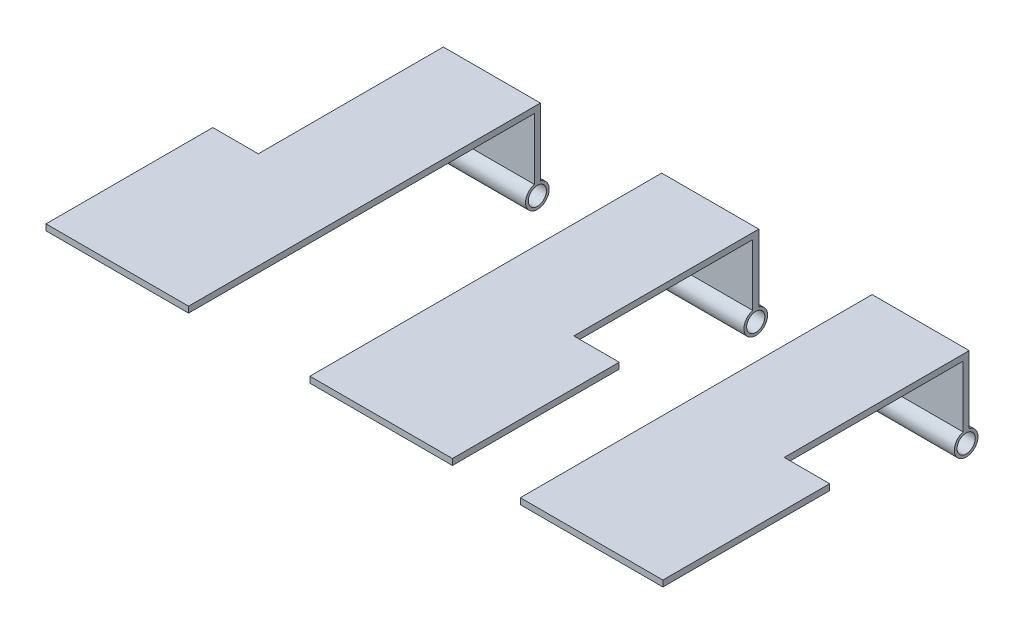
ISO-10303-21;
HEADER;
FILE_DESCRIPTION(('STEP AP214'),'2;1');
FILE_NAME('part.step','',(''),(''),'','','');
FILE_SCHEMA(('AUTOMOTIVE_DESIGN { 1 0 10303 214 1 1 1 1 }'));
ENDSEC;
DATA;
#1=APPLICATION_CONTEXT('core data for automotive mechanical design processes');
#2=APPLICATION_PROTOCOL_DEFINITION('international standard','automotive_design',2000,#1);
#3=PRODUCT_CONTEXT('',#1,'mechanical');
#4=PRODUCT('Part','Part','',(#3));
#5=PRODUCT_RELATED_PRODUCT_CATEGORY('part','',(#4));
#6=PRODUCT_DEFINITION_FORMATION('','',#4);
#7=PRODUCT_DEFINITION_CONTEXT('part definition',#1,'design');
#8=PRODUCT_DEFINITION('design','',#6,#7);
#9=PRODUCT_DEFINITION_SHAPE('','',#8);
#10=(LENGTH_UNIT() NAMED_UNIT(*) SI_UNIT(.MILLI.,.METRE.));
#11=(NAMED_UNIT(*) PLANE_ANGLE_UNIT() SI_UNIT($,.RADIAN.));
#12=(NAMED_UNIT(*) SI_UNIT($,.STERADIAN.) SOLID_ANGLE_UNIT());
#13=UNCERTAINTY_MEASURE_WITH_UNIT(LENGTH_MEASURE(1.E-05),#10,'distance_accuracy_value','');
#14=(GEOMETRIC_REPRESENTATION_CONTEXT(3) GLOBAL_UNCERTAINTY_ASSIGNED_CONTEXT((#13)) GLOBAL_UNIT_ASSIGNED_CONTEXT((#10,
#11,#12)) REPRESENTATION_CONTEXT('',''));
#15=CARTESIAN_POINT('',(0.,0.,0.));
#16=DIRECTION('',(0.,0.,1.));
#17=DIRECTION('',(1.,0.,0.));
#18=AXIS2_PLACEMENT_3D('',#15,#16,#17);
#19=CARTESIAN_POINT('',(16.,0.,0.500534490034143));
#20=DIRECTION('',(0.,0.,-1.));
#21=DIRECTION('',(-1.,0.,0.));
#22=AXIS2_PLACEMENT_3D('',#19,#20,#21);
#23=PLANE('',#22);
#24=DIRECTION('',(0.,-1.,0.));
#25=VECTOR('',#24,1.);
#26=CARTESIAN_POINT('',(16.,0.,0.500534490034143));
#27=LINE('',#26,#25);
#28=CARTESIAN_POINT('',(16.,12.,0.500534490034143));
#29=VERTEX_POINT('',#28);
#30=CARTESIAN_POINT('',(16.,1.88466581236204,0.500534490034143));
#31=VERTEX_POINT('',#30);
#32=EDGE_CURVE('E61',#29,#31,#27,.T.);
#33=ORIENTED_EDGE('',*,*,#32,.F.);
#34=DIRECTION('',(-1.,0.,0.));
#35=VECTOR('',#34,1.);
#36=CARTESIAN_POINT('',(16.,12.,0.500534490034143));
#37=LINE('',#36,#35);
#38=CARTESIAN_POINT('',(0.,12.,0.500534490034143));
#39=VERTEX_POINT('',#38);
#40=EDGE_CURVE('E65',#29,#39,#37,.T.);
#41=ORIENTED_EDGE('',*,*,#40,.T.);
#42=DIRECTION('',(0.,-1.,0.));
#43=VECTOR('',#42,1.);
#44=CARTESIAN_POINT('',(0.,0.,0.500534490034143));
#45=LINE('',#44,#43);
#46=CARTESIAN_POINT('',(0.,1.88466581236204,0.500534490034143));
#47=VERTEX_POINT('',#46);
#48=EDGE_CURVE('E116',#39,#47,#45,.T.);
#49=ORIENTED_EDGE('',*,*,#48,.T.);
#50=DIRECTION('',(-1.,0.,0.));
#51=VECTOR('',#50,1.);
#52=CARTESIAN_POINT('',(16.,1.88466581236204,0.500534490034143));
#53=LINE('',#52,#51);
#54=EDGE_CURVE('E12',#31,#47,#53,.T.);
#55=ORIENTED_EDGE('',*,*,#54,.F.);
#56=EDGE_LOOP('',(#33,#41,#49,#55));
#57=FACE_BOUND('',#56,.T.);
#58=ADVANCED_FACE('F46',(#57),#23,.F.);
#59=CARTESIAN_POINT('',(16.,0.,0.));
#60=DIRECTION('',(-1.,0.,0.));
#61=DIRECTION('',(0.,0.,1.));
#62=AXIS2_PLACEMENT_3D('',#59,#60,#61);
#63=CYLINDRICAL_SURFACE('',#62,1.95);
#64=CARTESIAN_POINT('',(0.,0.,0.));
#65=DIRECTION('',(1.,0.,0.));
#66=DIRECTION('',(0.,0.,-1.));
#67=AXIS2_PLACEMENT_3D('',#64,#65,#66);
#68=CIRCLE('',#67,1.95);
#69=CARTESIAN_POINT('',(0.,1.88494939039608,-0.499465509965857));
#70=VERTEX_POINT('',#69);
#71=EDGE_CURVE('E173',#47,#70,#68,.T.);
#72=ORIENTED_EDGE('',*,*,#71,.T.);
#73=DIRECTION('',(-1.,0.,0.));
#74=VECTOR('',#73,1.);
#75=CARTESIAN_POINT('',(16.,1.88494939039608,-0.499465509965857));
#76=LINE('',#75,#74);
#77=CARTESIAN_POINT('',(16.,1.88494939039608,-0.499465509965857));
#78=VERTEX_POINT('',#77);
#79=EDGE_CURVE('E54',#78,#70,#76,.T.);
#80=ORIENTED_EDGE('',*,*,#79,.F.);
#81=CARTESIAN_POINT('',(16.,0.,0.));
#82=DIRECTION('',(1.,0.,0.));
#83=DIRECTION('',(0.,0.,-1.));
#84=AXIS2_PLACEMENT_3D('',#81,#82,#83);
#85=CIRCLE('',#84,1.95);
#86=EDGE_CURVE('E162',#31,#78,#85,.T.);
#87=ORIENTED_EDGE('',*,*,#86,.F.);
#88=ORIENTED_EDGE('',*,*,#54,.T.);
#89=EDGE_LOOP('',(#72,#80,#87,#88));
#90=FACE_BOUND('',#89,.T.);
#91=ADVANCED_FACE('F189',(#90),#63,.T.);
#92=CARTESIAN_POINT('',(16.,0.,-0.499465509965857));
#93=DIRECTION('',(0.,0.,-1.));
#94=DIRECTION('',(-1.,0.,0.));
#95=AXIS2_PLACEMENT_3D('',#92,#93,#94);
#96=PLANE('',#95);
#97=DIRECTION('',(0.,-1.,0.));
#98=VECTOR('',#97,1.);
#99=CARTESIAN_POINT('',(0.,0.,-0.499465509965857));
#100=LINE('',#99,#98);
#101=CARTESIAN_POINT('',(0.,13.,-0.499465509965857));
#102=VERTEX_POINT('',#101);
#103=EDGE_CURVE('E176',#102,#70,#100,.T.);
#104=ORIENTED_EDGE('',*,*,#103,.F.);
#105=DIRECTION('',(-1.,0.,0.));
#106=VECTOR('',#105,1.);
#107=CARTESIAN_POINT('',(16.,13.,-0.499465509965857));
#108=LINE('',#107,#106);
#109=CARTESIAN_POINT('',(16.,13.,-0.499465509965857));
#110=VERTEX_POINT('',#109);
#111=EDGE_CURVE('E169',#110,#102,#108,.T.);
#112=ORIENTED_EDGE('',*,*,#111,.F.);
#113=DIRECTION('',(0.,-1.,0.));
#114=VECTOR('',#113,1.);
#115=CARTESIAN_POINT('',(16.,0.,-0.499465509965857));
#116=LINE('',#115,#114);
#117=EDGE_CURVE('E164',#110,#78,#116,.T.);
#118=ORIENTED_EDGE('',*,*,#117,.T.);
#119=ORIENTED_EDGE('',*,*,#79,.T.);
#120=EDGE_LOOP('',(#104,#112,#118,#119));
#121=FACE_BOUND('',#120,.T.);
#122=ADVANCED_FACE('F184',(#121),#96,.T.);
#123=CARTESIAN_POINT('',(16.,0.,0.));
#124=DIRECTION('',(-1.,0.,0.));
#125=DIRECTION('',(0.,0.,1.));
#126=AXIS2_PLACEMENT_3D('',#123,#124,#125);
#127=CYLINDRICAL_SURFACE('',#126,1.5);
#128=CARTESIAN_POINT('',(16.,0.,0.));
#129=DIRECTION('',(1.,0.,0.));
#130=DIRECTION('',(0.,0.,-1.));
#131=AXIS2_PLACEMENT_3D('',#128,#129,#130);
#132=CIRCLE('',#131,1.5);
#133=CARTESIAN_POINT('',(16.,0.,-1.5));
#134=VERTEX_POINT('',#133);
#135=EDGE_CURVE('E157',#134,#134,#132,.T.);
#136=ORIENTED_EDGE('',*,*,#135,.T.);
#137=EDGE_LOOP('',(#136));
#138=FACE_BOUND('',#137,.T.);
#139=CARTESIAN_POINT('',(0.,0.,0.));
#140=DIRECTION('',(1.,0.,0.));
#141=DIRECTION('',(0.,0.,-1.));
#142=AXIS2_PLACEMENT_3D('',#139,#140,#141);
#143=CIRCLE('',#142,1.5);
#144=CARTESIAN_POINT('',(0.,0.,-1.5));
#145=VERTEX_POINT('',#144);
#146=EDGE_CURVE('E156',#145,#145,#143,.T.);
#147=ORIENTED_EDGE('',*,*,#146,.F.);
#148=EDGE_LOOP('',(#147));
#149=FACE_BOUND('',#148,.T.);
#150=ADVANCED_FACE('F48',(#138,#149),#127,.F.);
#151=CARTESIAN_POINT('',(16.,13.,0.));
#152=DIRECTION('',(0.,1.,0.));
#153=DIRECTION('',(0.,0.,1.));
#154=AXIS2_PLACEMENT_3D('',#151,#152,#153);
#155=PLANE('',#154);
#156=ORIENTED_EDGE('',*,*,#111,.T.);
#157=DIRECTION('',(0.,0.,-1.));
#158=VECTOR('',#157,1.);
#159=CARTESIAN_POINT('',(0.,13.,0.));
#160=LINE('',#159,#158);
#161=CARTESIAN_POINT('',(0.,13.,57.5));
#162=VERTEX_POINT('',#161);
#163=EDGE_CURVE('E160',#162,#102,#160,.T.);
#164=ORIENTED_EDGE('',*,*,#163,.F.);
#165=DIRECTION('',(1.,0.,0.));
#166=VECTOR('',#165,1.);
#167=CARTESIAN_POINT('',(0.,13.,57.5));
#168=LINE('',#167,#166);
#169=CARTESIAN_POINT('',(23.5,13.,57.5));
#170=VERTEX_POINT('',#169);
#171=EDGE_CURVE('E126',#162,#170,#168,.T.);
#172=ORIENTED_EDGE('',*,*,#171,.T.);
#173=DIRECTION('',(0.,0.,-1.));
#174=VECTOR('',#173,1.);
#175=CARTESIAN_POINT('',(23.5,13.,30.0005344900341));
#176=LINE('',#175,#174);
#177=CARTESIAN_POINT('',(23.5,13.,30.0005344900341));
#178=VERTEX_POINT('',#177);
#179=EDGE_CURVE('E144',#170,#178,#176,.T.);
#180=ORIENTED_EDGE('',*,*,#179,.T.);
#181=DIRECTION('',(-1.,0.,0.));
#182=VECTOR('',#181,1.);
#183=CARTESIAN_POINT('',(16.,13.,30.0005344900341));
#184=LINE('',#183,#182);
#185=CARTESIAN_POINT('',(16.,13.,30.0005344900341));
#186=VERTEX_POINT('',#185);
#187=EDGE_CURVE('E120',#178,#186,#184,.T.);
#188=ORIENTED_EDGE('',*,*,#187,.T.);
#189=DIRECTION('',(0.,0.,-1.));
#190=VECTOR('',#189,1.);
#191=CARTESIAN_POINT('',(16.,13.,0.));
#192=LINE('',#191,#190);
#193=EDGE_CURVE('E167',#186,#110,#192,.T.);
#194=ORIENTED_EDGE('',*,*,#193,.T.);
#195=EDGE_LOOP('',(#156,#164,#172,#180,#188,#194));
#196=FACE_BOUND('',#195,.T.);
#197=ADVANCED_FACE('F191',(#196),#155,.T.);
#198=CARTESIAN_POINT('',(16.,0.,0.));
#199=DIRECTION('',(1.,0.,0.));
#200=DIRECTION('',(0.,0.,-1.));
#201=AXIS2_PLACEMENT_3D('',#198,#199,#200);
#202=PLANE('',#201);
#203=ORIENTED_EDGE('',*,*,#117,.F.);
#204=ORIENTED_EDGE('',*,*,#193,.F.);
#205=DIRECTION('',(0.,1.,0.));
#206=VECTOR('',#205,1.);
#207=CARTESIAN_POINT('',(16.,12.,30.0005344900341));
#208=LINE('',#207,#206);
#209=CARTESIAN_POINT('',(16.,12.,30.0005344900341));
#210=VERTEX_POINT('',#209);
#211=EDGE_CURVE('E149',#210,#186,#208,.T.);
#212=ORIENTED_EDGE('',*,*,#211,.F.);
#213=DIRECTION('',(0.,0.,-1.));
#214=VECTOR('',#213,1.);
#215=CARTESIAN_POINT('',(16.,12.,0.000534490034142989));
#216=LINE('',#215,#214);
#217=EDGE_CURVE('E128',#210,#29,#216,.T.);
#218=ORIENTED_EDGE('',*,*,#217,.T.);
#219=ORIENTED_EDGE('',*,*,#32,.T.);
#220=ORIENTED_EDGE('',*,*,#86,.T.);
#221=EDGE_LOOP('',(#203,#204,#212,#218,#219,#220));
#222=FACE_BOUND('',#221,.T.);
#223=ORIENTED_EDGE('',*,*,#135,.F.);
#224=EDGE_LOOP('',(#223));
#225=FACE_BOUND('',#224,.T.);
#226=ADVANCED_FACE('F193',(#222,#225),#202,.T.);
#227=CARTESIAN_POINT('',(0.,0.,0.));
#228=DIRECTION('',(1.,0.,0.));
#229=DIRECTION('',(0.,0.,-1.));
#230=AXIS2_PLACEMENT_3D('',#227,#228,#229);
#231=PLANE('',#230);
#232=ORIENTED_EDGE('',*,*,#163,.T.);
#233=ORIENTED_EDGE('',*,*,#103,.T.);
#234=ORIENTED_EDGE('',*,*,#71,.F.);
#235=ORIENTED_EDGE('',*,*,#48,.F.);
#236=DIRECTION('',(0.,0.,1.));
#237=VECTOR('',#236,1.);
#238=CARTESIAN_POINT('',(0.,12.,0.));
#239=LINE('',#238,#237);
#240=CARTESIAN_POINT('',(0.,12.,57.5));
#241=VERTEX_POINT('',#240);
#242=EDGE_CURVE('E109',#39,#241,#239,.T.);
#243=ORIENTED_EDGE('',*,*,#242,.T.);
#244=DIRECTION('',(0.,1.,0.));
#245=VECTOR('',#244,1.);
#246=CARTESIAN_POINT('',(0.,12.,57.5));
#247=LINE('',#246,#245);
#248=EDGE_CURVE('E113',#241,#162,#247,.T.);
#249=ORIENTED_EDGE('',*,*,#248,.T.);
#250=EDGE_LOOP('',(#232,#233,#234,#235,#243,#249));
#251=FACE_BOUND('',#250,.T.);
#252=ORIENTED_EDGE('',*,*,#146,.T.);
#253=EDGE_LOOP('',(#252));
#254=FACE_BOUND('',#253,.T.);
#255=ADVANCED_FACE('F111',(#251,#254),#231,.F.);
#256=CARTESIAN_POINT('',(0.,12.,0.));
#257=DIRECTION('',(0.,-1.,0.));
#258=DIRECTION('',(0.,0.,-1.));
#259=AXIS2_PLACEMENT_3D('',#256,#257,#258);
#260=PLANE('',#259);
#261=ORIENTED_EDGE('',*,*,#40,.F.);
#262=ORIENTED_EDGE('',*,*,#217,.F.);
#263=DIRECTION('',(-1.,0.,0.));
#264=VECTOR('',#263,1.);
#265=CARTESIAN_POINT('',(16.,12.,30.0005344900341));
#266=LINE('',#265,#264);
#267=CARTESIAN_POINT('',(23.5,12.,30.0005344900341));
#268=VERTEX_POINT('',#267);
#269=EDGE_CURVE('E136',#268,#210,#266,.T.);
#270=ORIENTED_EDGE('',*,*,#269,.F.);
#271=DIRECTION('',(0.,0.,-1.));
#272=VECTOR('',#271,1.);
#273=CARTESIAN_POINT('',(23.5,12.,30.0005344900341));
#274=LINE('',#273,#272);
#275=CARTESIAN_POINT('',(23.5,12.,57.5));
#276=VERTEX_POINT('',#275);
#277=EDGE_CURVE('E134',#276,#268,#274,.T.);
#278=ORIENTED_EDGE('',*,*,#277,.F.);
#279=DIRECTION('',(1.,0.,0.));
#280=VECTOR('',#279,1.);
#281=CARTESIAN_POINT('',(0.,12.,57.5));
#282=LINE('',#281,#280);
#283=EDGE_CURVE('E119',#241,#276,#282,.T.);
#284=ORIENTED_EDGE('',*,*,#283,.F.);
#285=ORIENTED_EDGE('',*,*,#242,.F.);
#286=EDGE_LOOP('',(#261,#262,#270,#278,#284,#285));
#287=FACE_BOUND('',#286,.T.);
#288=ADVANCED_FACE('F131',(#287),#260,.T.);
#289=CARTESIAN_POINT('',(16.,12.,30.0005344900341));
#290=DIRECTION('',(0.,0.,-1.));
#291=DIRECTION('',(-1.,0.,0.));
#292=AXIS2_PLACEMENT_3D('',#289,#290,#291);
#293=PLANE('',#292);
#294=ORIENTED_EDGE('',*,*,#187,.F.);
#295=DIRECTION('',(0.,1.,0.));
#296=VECTOR('',#295,1.);
#297=CARTESIAN_POINT('',(23.5,12.,30.0005344900341));
#298=LINE('',#297,#296);
#299=EDGE_CURVE('E152',#268,#178,#298,.T.);
#300=ORIENTED_EDGE('',*,*,#299,.F.);
#301=ORIENTED_EDGE('',*,*,#269,.T.);
#302=ORIENTED_EDGE('',*,*,#211,.T.);
#303=EDGE_LOOP('',(#294,#300,#301,#302));
#304=FACE_BOUND('',#303,.T.);
#305=ADVANCED_FACE('F214',(#304),#293,.T.);
#306=CARTESIAN_POINT('',(23.5,12.,30.0005344900341));
#307=DIRECTION('',(1.,0.,0.));
#308=DIRECTION('',(0.,0.,-1.));
#309=AXIS2_PLACEMENT_3D('',#306,#307,#308);
#310=PLANE('',#309);
#311=ORIENTED_EDGE('',*,*,#179,.F.);
#312=DIRECTION('',(0.,1.,0.));
#313=VECTOR('',#312,1.);
#314=CARTESIAN_POINT('',(23.5,12.,57.5));
#315=LINE('',#314,#313);
#316=EDGE_CURVE('E127',#276,#170,#315,.T.);
#317=ORIENTED_EDGE('',*,*,#316,.F.);
#318=ORIENTED_EDGE('',*,*,#277,.T.);
#319=ORIENTED_EDGE('',*,*,#299,.T.);
#320=EDGE_LOOP('',(#311,#317,#318,#319));
#321=FACE_BOUND('',#320,.T.);
#322=ADVANCED_FACE('F211',(#321),#310,.T.);
#323=CARTESIAN_POINT('',(0.,12.,57.5));
#324=DIRECTION('',(0.,0.,1.));
#325=DIRECTION('',(1.,0.,0.));
#326=AXIS2_PLACEMENT_3D('',#323,#324,#325);
#327=PLANE('',#326);
#328=ORIENTED_EDGE('',*,*,#171,.F.);
#329=ORIENTED_EDGE('',*,*,#248,.F.);
#330=ORIENTED_EDGE('',*,*,#283,.T.);
#331=ORIENTED_EDGE('',*,*,#316,.T.);
#332=EDGE_LOOP('',(#328,#329,#330,#331));
#333=FACE_BOUND('',#332,.T.);
#334=ADVANCED_FACE('F124',(#333),#327,.T.);
#335=CLOSED_SHELL('',(#58,#91,#122,#150,#197,#226,#255,#288,#305,#322,#334));
#336=MANIFOLD_SOLID_BREP('B2',#335);
#337=CARTESIAN_POINT('',(-70.6908921558042,0.,0.500534490034143));
#338=DIRECTION('',(0.,0.,-1.));
#339=DIRECTION('',(1.,0.,0.));
#340=AXIS2_PLACEMENT_3D('',#337,#338,#339);
#341=PLANE('',#340);
#342=DIRECTION('',(0.,-1.,0.));
#343=VECTOR('',#342,1.);
#344=CARTESIAN_POINT('',(-70.6908921558042,0.,0.500534490034143));
#345=LINE('',#344,#343);
#346=CARTESIAN_POINT('',(-70.6908921558042,12.,0.500534490034143));
#347=VERTEX_POINT('',#346);
#348=CARTESIAN_POINT('',(-70.6908921558042,1.88466581236204,0.500534490034143));
#349=VERTEX_POINT('',#348);
#350=EDGE_CURVE('E415',#347,#349,#345,.T.);
#351=ORIENTED_EDGE('',*,*,#350,.T.);
#352=DIRECTION('',(1.,0.,0.));
#353=VECTOR('',#352,1.);
#354=CARTESIAN_POINT('',(-70.6908921558042,1.88466581236204,0.500534490034143));
#355=LINE('',#354,#353);
#356=CARTESIAN_POINT('',(-54.6908921558042,1.88466581236204,0.500534490034143));
#357=VERTEX_POINT('',#356);
#358=EDGE_CURVE('E44',#349,#357,#355,.T.);
#359=ORIENTED_EDGE('',*,*,#358,.T.);
#360=DIRECTION('',(0.,-1.,0.));
#361=VECTOR('',#360,1.);
#362=CARTESIAN_POINT('',(-54.6908921558042,0.,0.500534490034143));
#363=LINE('',#362,#361);
#364=CARTESIAN_POINT('',(-54.6908921558042,12.,0.500534490034143));
#365=VERTEX_POINT('',#364);
#366=EDGE_CURVE('E428',#365,#357,#363,.T.);
#367=ORIENTED_EDGE('',*,*,#366,.F.);
#368=DIRECTION('',(1.,0.,0.));
#369=VECTOR('',#368,1.);
#370=CARTESIAN_POINT('',(-70.6908921558042,12.,0.500534490034143));
#371=LINE('',#370,#369);
#372=EDGE_CURVE('E393',#347,#365,#371,.T.);
#373=ORIENTED_EDGE('',*,*,#372,.F.);
#374=EDGE_LOOP('',(#351,#359,#367,#373));
#375=FACE_BOUND('',#374,.T.);
#376=ADVANCED_FACE('F316',(#375),#341,.F.);
#377=CARTESIAN_POINT('',(-70.6908921558042,0.,0.));
#378=DIRECTION('',(1.,0.,0.));
#379=DIRECTION('',(0.,0.,1.));
#380=AXIS2_PLACEMENT_3D('',#377,#378,#379);
#381=CYLINDRICAL_SURFACE('',#380,1.95);
#382=CARTESIAN_POINT('',(-54.6908921558042,0.,0.));
#383=DIRECTION('',(1.,0.,0.));
#384=DIRECTION('',(0.,0.,-1.));
#385=AXIS2_PLACEMENT_3D('',#382,#383,#384);
#386=CIRCLE('',#385,1.95);
#387=CARTESIAN_POINT('',(-54.6908921558042,1.88494939039608,-0.499465509965857));
#388=VERTEX_POINT('',#387);
#389=EDGE_CURVE('E430',#357,#388,#386,.T.);
#390=ORIENTED_EDGE('',*,*,#389,.F.);
#391=ORIENTED_EDGE('',*,*,#358,.F.);
#392=CARTESIAN_POINT('',(-70.6908921558042,0.,0.));
#393=DIRECTION('',(1.,0.,0.));
#394=DIRECTION('',(0.,0.,-1.));
#395=AXIS2_PLACEMENT_3D('',#392,#393,#394);
#396=CIRCLE('',#395,1.95);
#397=CARTESIAN_POINT('',(-70.6908921558042,1.88494939039608,-0.499465509965857));
#398=VERTEX_POINT('',#397);
#399=EDGE_CURVE('E418',#349,#398,#396,.T.);
#400=ORIENTED_EDGE('',*,*,#399,.T.);
#401=DIRECTION('',(1.,0.,0.));
#402=VECTOR('',#401,1.);
#403=CARTESIAN_POINT('',(-70.6908921558042,1.88494939039608,-0.499465509965857));
#404=LINE('',#403,#402);
#405=EDGE_CURVE('E324',#398,#388,#404,.T.);
#406=ORIENTED_EDGE('',*,*,#405,.T.);
#407=EDGE_LOOP('',(#390,#391,#400,#406));
#408=FACE_BOUND('',#407,.T.);
#409=ADVANCED_FACE('F440',(#408),#381,.T.);
#410=CARTESIAN_POINT('',(-70.6908921558042,0.,-0.499465509965857));
#411=DIRECTION('',(0.,0.,-1.));
#412=DIRECTION('',(1.,0.,0.));
#413=AXIS2_PLACEMENT_3D('',#410,#411,#412);
#414=PLANE('',#413);
#415=DIRECTION('',(0.,-1.,0.));
#416=VECTOR('',#415,1.);
#417=CARTESIAN_POINT('',(-54.6908921558042,0.,-0.499465509965857));
#418=LINE('',#417,#416);
#419=CARTESIAN_POINT('',(-54.6908921558042,13.,-0.499465509965857));
#420=VERTEX_POINT('',#419);
#421=EDGE_CURVE('E433',#420,#388,#418,.T.);
#422=ORIENTED_EDGE('',*,*,#421,.T.);
#423=ORIENTED_EDGE('',*,*,#405,.F.);
#424=DIRECTION('',(0.,-1.,0.));
#425=VECTOR('',#424,1.);
#426=CARTESIAN_POINT('',(-70.6908921558042,0.,-0.499465509965857));
#427=LINE('',#426,#425);
#428=CARTESIAN_POINT('',(-70.6908921558042,13.,-0.499465509965857));
#429=VERTEX_POINT('',#428);
#430=EDGE_CURVE('E421',#429,#398,#427,.T.);
#431=ORIENTED_EDGE('',*,*,#430,.F.);
#432=DIRECTION('',(1.,0.,0.));
#433=VECTOR('',#432,1.);
#434=CARTESIAN_POINT('',(-70.6908921558042,13.,-0.499465509965857));
#435=LINE('',#434,#433);
#436=EDGE_CURVE('E425',#429,#420,#435,.T.);
#437=ORIENTED_EDGE('',*,*,#436,.T.);
#438=EDGE_LOOP('',(#422,#423,#431,#437));
#439=FACE_BOUND('',#438,.T.);
#440=ADVANCED_FACE('F451',(#439),#414,.T.);
#441=CARTESIAN_POINT('',(-70.6908921558042,0.,0.));
#442=DIRECTION('',(1.,0.,0.));
#443=DIRECTION('',(0.,0.,1.));
#444=AXIS2_PLACEMENT_3D('',#441,#442,#443);
#445=CYLINDRICAL_SURFACE('',#444,1.5);
#446=CARTESIAN_POINT('',(-70.6908921558042,0.,0.));
#447=DIRECTION('',(1.,0.,0.));
#448=DIRECTION('',(0.,0.,-1.));
#449=AXIS2_PLACEMENT_3D('',#446,#447,#448);
#450=CIRCLE('',#449,1.5);
#451=CARTESIAN_POINT('',(-70.6908921558042,0.,-1.5));
#452=VERTEX_POINT('',#451);
#453=EDGE_CURVE('E412',#452,#452,#450,.T.);
#454=ORIENTED_EDGE('',*,*,#453,.F.);
#455=EDGE_LOOP('',(#454));
#456=FACE_BOUND('',#455,.T.);
#457=CARTESIAN_POINT('',(-54.6908921558042,0.,0.));
#458=DIRECTION('',(1.,0.,0.));
#459=DIRECTION('',(0.,0.,-1.));
#460=AXIS2_PLACEMENT_3D('',#457,#458,#459);
#461=CIRCLE('',#460,1.5);
#462=CARTESIAN_POINT('',(-54.6908921558042,0.,-1.5));
#463=VERTEX_POINT('',#462);
#464=EDGE_CURVE('E410',#463,#463,#461,.T.);
#465=ORIENTED_EDGE('',*,*,#464,.T.);
#466=EDGE_LOOP('',(#465));
#467=FACE_BOUND('',#466,.T.);
#468=ADVANCED_FACE('F318',(#456,#467),#445,.F.);
#469=CARTESIAN_POINT('',(-70.6908921558042,13.,0.));
#470=DIRECTION('',(0.,1.,0.));
#471=DIRECTION('',(0.,0.,1.));
#472=AXIS2_PLACEMENT_3D('',#469,#470,#471);
#473=PLANE('',#472);
#474=ORIENTED_EDGE('',*,*,#436,.F.);
#475=DIRECTION('',(0.,0.,-1.));
#476=VECTOR('',#475,1.);
#477=CARTESIAN_POINT('',(-70.6908921558042,13.,0.));
#478=LINE('',#477,#476);
#479=CARTESIAN_POINT('',(-70.6908921558042,13.,30.0005344900341));
#480=VERTEX_POINT('',#479);
#481=EDGE_CURVE('E423',#480,#429,#478,.T.);
#482=ORIENTED_EDGE('',*,*,#481,.F.);
#483=DIRECTION('',(1.,0.,0.));
#484=VECTOR('',#483,1.);
#485=CARTESIAN_POINT('',(-70.6908921558042,13.,30.0005344900341));
#486=LINE('',#485,#484);
#487=CARTESIAN_POINT('',(-78.1908921558042,13.,30.0005344900341));
#488=VERTEX_POINT('',#487);
#489=EDGE_CURVE('E395',#488,#480,#486,.T.);
#490=ORIENTED_EDGE('',*,*,#489,.F.);
#491=DIRECTION('',(0.,0.,-1.));
#492=VECTOR('',#491,1.);
#493=CARTESIAN_POINT('',(-78.1908921558042,13.,30.0005344900341));
#494=LINE('',#493,#492);
#495=CARTESIAN_POINT('',(-78.1908921558042,13.,57.5));
#496=VERTEX_POINT('',#495);
#497=EDGE_CURVE('E458',#496,#488,#494,.T.);
#498=ORIENTED_EDGE('',*,*,#497,.F.);
#499=DIRECTION('',(-1.,0.,0.));
#500=VECTOR('',#499,1.);
#501=CARTESIAN_POINT('',(-54.6908921558042,13.,57.5));
#502=LINE('',#501,#500);
#503=CARTESIAN_POINT('',(-54.6908921558042,13.,57.5));
#504=VERTEX_POINT('',#503);
#505=EDGE_CURVE('E456',#504,#496,#502,.T.);
#506=ORIENTED_EDGE('',*,*,#505,.F.);
#507=DIRECTION('',(0.,0.,-1.));
#508=VECTOR('',#507,1.);
#509=CARTESIAN_POINT('',(-54.6908921558042,13.,0.));
#510=LINE('',#509,#508);
#511=EDGE_CURVE('E400',#504,#420,#510,.T.);
#512=ORIENTED_EDGE('',*,*,#511,.T.);
#513=EDGE_LOOP('',(#474,#482,#490,#498,#506,#512));
#514=FACE_BOUND('',#513,.T.);
#515=ADVANCED_FACE('F453',(#514),#473,.T.);
#516=CARTESIAN_POINT('',(-70.6908921558042,0.,0.));
#517=DIRECTION('',(-1.,0.,0.));
#518=DIRECTION('',(0.,0.,-1.));
#519=AXIS2_PLACEMENT_3D('',#516,#517,#518);
#520=PLANE('',#519);
#521=ORIENTED_EDGE('',*,*,#430,.T.);
#522=ORIENTED_EDGE('',*,*,#399,.F.);
#523=ORIENTED_EDGE('',*,*,#350,.F.);
#524=DIRECTION('',(0.,0.,-1.));
#525=VECTOR('',#524,1.);
#526=CARTESIAN_POINT('',(-70.6908921558042,12.,0.000534490034142989));
#527=LINE('',#526,#525);
#528=CARTESIAN_POINT('',(-70.6908921558042,12.,30.0005344900341));
#529=VERTEX_POINT('',#528);
#530=EDGE_CURVE('E331',#529,#347,#527,.T.);
#531=ORIENTED_EDGE('',*,*,#530,.F.);
#532=DIRECTION('',(0.,1.,0.));
#533=VECTOR('',#532,1.);
#534=CARTESIAN_POINT('',(-70.6908921558042,12.,30.0005344900341));
#535=LINE('',#534,#533);
#536=EDGE_CURVE('E411',#529,#480,#535,.T.);
#537=ORIENTED_EDGE('',*,*,#536,.T.);
#538=ORIENTED_EDGE('',*,*,#481,.T.);
#539=EDGE_LOOP('',(#521,#522,#523,#531,#537,#538));
#540=FACE_BOUND('',#539,.T.);
#541=ORIENTED_EDGE('',*,*,#453,.T.);
#542=EDGE_LOOP('',(#541));
#543=FACE_BOUND('',#542,.T.);
#544=ADVANCED_FACE('F447',(#540,#543),#520,.T.);
#545=CARTESIAN_POINT('',(-54.6908921558042,0.,0.));
#546=DIRECTION('',(-1.,0.,0.));
#547=DIRECTION('',(0.,0.,-1.));
#548=AXIS2_PLACEMENT_3D('',#545,#546,#547);
#549=PLANE('',#548);
#550=ORIENTED_EDGE('',*,*,#511,.F.);
#551=DIRECTION('',(0.,1.,0.));
#552=VECTOR('',#551,1.);
#553=CARTESIAN_POINT('',(-54.6908921558042,12.,57.5));
#554=LINE('',#553,#552);
#555=CARTESIAN_POINT('',(-54.6908921558042,12.,57.5));
#556=VERTEX_POINT('',#555);
#557=EDGE_CURVE('E385',#556,#504,#554,.T.);
#558=ORIENTED_EDGE('',*,*,#557,.F.);
#559=DIRECTION('',(0.,0.,1.));
#560=VECTOR('',#559,1.);
#561=CARTESIAN_POINT('',(-54.6908921558042,12.,0.));
#562=LINE('',#561,#560);
#563=EDGE_CURVE('E339',#365,#556,#562,.T.);
#564=ORIENTED_EDGE('',*,*,#563,.F.);
#565=ORIENTED_EDGE('',*,*,#366,.T.);
#566=ORIENTED_EDGE('',*,*,#389,.T.);
#567=ORIENTED_EDGE('',*,*,#421,.F.);
#568=EDGE_LOOP('',(#550,#558,#564,#565,#566,#567));
#569=FACE_BOUND('',#568,.T.);
#570=ORIENTED_EDGE('',*,*,#464,.F.);
#571=EDGE_LOOP('',(#570));
#572=FACE_BOUND('',#571,.T.);
#573=ADVANCED_FACE('F397',(#569,#572),#549,.F.);
#574=CARTESIAN_POINT('',(-54.6908921558042,12.,0.));
#575=DIRECTION('',(0.,-1.,0.));
#576=DIRECTION('',(0.,0.,-1.));
#577=AXIS2_PLACEMENT_3D('',#574,#575,#576);
#578=PLANE('',#577);
#579=ORIENTED_EDGE('',*,*,#372,.T.);
#580=ORIENTED_EDGE('',*,*,#563,.T.);
#581=DIRECTION('',(-1.,0.,0.));
#582=VECTOR('',#581,1.);
#583=CARTESIAN_POINT('',(-54.6908921558042,12.,57.5));
#584=LINE('',#583,#582);
#585=CARTESIAN_POINT('',(-78.1908921558042,12.,57.5));
#586=VERTEX_POINT('',#585);
#587=EDGE_CURVE('E382',#556,#586,#584,.T.);
#588=ORIENTED_EDGE('',*,*,#587,.T.);
#589=DIRECTION('',(0.,0.,-1.));
#590=VECTOR('',#589,1.);
#591=CARTESIAN_POINT('',(-78.1908921558042,12.,30.0005344900341));
#592=LINE('',#591,#590);
#593=CARTESIAN_POINT('',(-78.1908921558042,12.,30.0005344900341));
#594=VERTEX_POINT('',#593);
#595=EDGE_CURVE('E390',#586,#594,#592,.T.);
#596=ORIENTED_EDGE('',*,*,#595,.T.);
#597=DIRECTION('',(1.,0.,0.));
#598=VECTOR('',#597,1.);
#599=CARTESIAN_POINT('',(-70.6908921558042,12.,30.0005344900341));
#600=LINE('',#599,#598);
#601=EDGE_CURVE('E405',#594,#529,#600,.T.);
#602=ORIENTED_EDGE('',*,*,#601,.T.);
#603=ORIENTED_EDGE('',*,*,#530,.T.);
#604=EDGE_LOOP('',(#579,#580,#588,#596,#602,#603));
#605=FACE_BOUND('',#604,.T.);
#606=ADVANCED_FACE('F392',(#605),#578,.T.);
#607=CARTESIAN_POINT('',(-70.6908921558042,12.,30.0005344900341));
#608=DIRECTION('',(0.,0.,-1.));
#609=DIRECTION('',(1.,0.,0.));
#610=AXIS2_PLACEMENT_3D('',#607,#608,#609);
#611=PLANE('',#610);
#612=ORIENTED_EDGE('',*,*,#489,.T.);
#613=ORIENTED_EDGE('',*,*,#536,.F.);
#614=ORIENTED_EDGE('',*,*,#601,.F.);
#615=DIRECTION('',(0.,1.,0.));
#616=VECTOR('',#615,1.);
#617=CARTESIAN_POINT('',(-78.1908921558042,12.,30.0005344900341));
#618=LINE('',#617,#616);
#619=EDGE_CURVE('E403',#594,#488,#618,.T.);
#620=ORIENTED_EDGE('',*,*,#619,.T.);
#621=EDGE_LOOP('',(#612,#613,#614,#620));
#622=FACE_BOUND('',#621,.T.);
#623=ADVANCED_FACE('F467',(#622),#611,.T.);
#624=CARTESIAN_POINT('',(-78.1908921558042,12.,30.0005344900341));
#625=DIRECTION('',(-1.,0.,0.));
#626=DIRECTION('',(0.,0.,-1.));
#627=AXIS2_PLACEMENT_3D('',#624,#625,#626);
#628=PLANE('',#627);
#629=ORIENTED_EDGE('',*,*,#497,.T.);
#630=ORIENTED_EDGE('',*,*,#619,.F.);
#631=ORIENTED_EDGE('',*,*,#595,.F.);
#632=DIRECTION('',(0.,1.,0.));
#633=VECTOR('',#632,1.);
#634=CARTESIAN_POINT('',(-78.1908921558042,12.,57.5));
#635=LINE('',#634,#633);
#636=EDGE_CURVE('E387',#586,#496,#635,.T.);
#637=ORIENTED_EDGE('',*,*,#636,.T.);
#638=EDGE_LOOP('',(#629,#630,#631,#637));
#639=FACE_BOUND('',#638,.T.);
#640=ADVANCED_FACE('F470',(#639),#628,.T.);
#641=CARTESIAN_POINT('',(-54.6908921558042,12.,57.5));
#642=DIRECTION('',(0.,0.,1.));
#643=DIRECTION('',(-1.,0.,0.));
#644=AXIS2_PLACEMENT_3D('',#641,#642,#643);
#645=PLANE('',#644);
#646=ORIENTED_EDGE('',*,*,#505,.T.);
#647=ORIENTED_EDGE('',*,*,#636,.F.);
#648=ORIENTED_EDGE('',*,*,#587,.F.);
#649=ORIENTED_EDGE('',*,*,#557,.T.);
#650=EDGE_LOOP('',(#646,#647,#648,#649));
#651=FACE_BOUND('',#650,.T.);
#652=ADVANCED_FACE('F384',(#651),#645,.T.);
#653=CLOSED_SHELL('',(#376,#409,#440,#468,#515,#544,#573,#606,#623,#640,#652));
#654=MANIFOLD_SOLID_BREP('B6',#653);
#655=CARTESIAN_POINT('',(-18.6908921558042,0.,0.500534490034143));
#656=DIRECTION('',(0.,0.,-1.));
#657=DIRECTION('',(-1.,0.,0.));
#658=AXIS2_PLACEMENT_3D('',#655,#656,#657);
#659=PLANE('',#658);
#660=DIRECTION('',(0.,-1.,0.));
#661=VECTOR('',#660,1.);
#662=CARTESIAN_POINT('',(-18.6908921558042,0.,0.500534490034143));
#663=LINE('',#662,#661);
#664=CARTESIAN_POINT('',(-18.6908921558042,12.,0.500534490034143));
#665=VERTEX_POINT('',#664);
#666=CARTESIAN_POINT('',(-18.6908921558042,1.88466581236204,0.500534490034143));
#667=VERTEX_POINT('',#666);
#668=EDGE_CURVE('E592',#665,#667,#663,.T.);
#669=ORIENTED_EDGE('',*,*,#668,.F.);
#670=DIRECTION('',(-1.,0.,0.));
#671=VECTOR('',#670,1.);
#672=CARTESIAN_POINT('',(-18.6908921558042,12.,0.500534490034143));
#673=LINE('',#672,#671);
#674=CARTESIAN_POINT('',(-34.6908921558042,12.,0.500534490034143));
#675=VERTEX_POINT('',#674);
#676=EDGE_CURVE('E596',#665,#675,#673,.T.);
#677=ORIENTED_EDGE('',*,*,#676,.T.);
#678=DIRECTION('',(0.,-1.,0.));
#679=VECTOR('',#678,1.);
#680=CARTESIAN_POINT('',(-34.6908921558042,0.,0.500534490034143));
#681=LINE('',#680,#679);
#682=CARTESIAN_POINT('',(-34.6908921558042,1.88466581236204,0.500534490034143));
#683=VERTEX_POINT('',#682);
#684=EDGE_CURVE('E647',#675,#683,#681,.T.);
#685=ORIENTED_EDGE('',*,*,#684,.T.);
#686=DIRECTION('',(-1.,0.,0.));
#687=VECTOR('',#686,1.);
#688=CARTESIAN_POINT('',(-18.6908921558042,1.88466581236204,0.500534490034143));
#689=LINE('',#688,#687);
#690=EDGE_CURVE('E314',#667,#683,#689,.T.);
#691=ORIENTED_EDGE('',*,*,#690,.F.);
#692=EDGE_LOOP('',(#669,#677,#685,#691));
#693=FACE_BOUND('',#692,.T.);
#694=ADVANCED_FACE('F577',(#693),#659,.F.);
#695=CARTESIAN_POINT('',(-18.6908921558042,0.,0.));
#696=DIRECTION('',(-1.,0.,0.));
#697=DIRECTION('',(0.,0.,1.));
#698=AXIS2_PLACEMENT_3D('',#695,#696,#697);
#699=CYLINDRICAL_SURFACE('',#698,1.95);
#700=CARTESIAN_POINT('',(-34.6908921558042,0.,0.));
#701=DIRECTION('',(1.,0.,0.));
#702=DIRECTION('',(0.,0.,-1.));
#703=AXIS2_PLACEMENT_3D('',#700,#701,#702);
#704=CIRCLE('',#703,1.95);
#705=CARTESIAN_POINT('',(-34.6908921558042,1.88494939039608,-0.499465509965857));
#706=VERTEX_POINT('',#705);
#707=EDGE_CURVE('E704',#683,#706,#704,.T.);
#708=ORIENTED_EDGE('',*,*,#707,.T.);
#709=DIRECTION('',(-1.,0.,0.));
#710=VECTOR('',#709,1.);
#711=CARTESIAN_POINT('',(-18.6908921558042,1.88494939039608,-0.499465509965857));
#712=LINE('',#711,#710);
#713=CARTESIAN_POINT('',(-18.6908921558042,1.88494939039608,-0.499465509965857));
#714=VERTEX_POINT('',#713);
#715=EDGE_CURVE('E585',#714,#706,#712,.T.);
#716=ORIENTED_EDGE('',*,*,#715,.F.);
#717=CARTESIAN_POINT('',(-18.6908921558042,0.,0.));
#718=DIRECTION('',(1.,0.,0.));
#719=DIRECTION('',(0.,0.,-1.));
#720=AXIS2_PLACEMENT_3D('',#717,#718,#719);
#721=CIRCLE('',#720,1.95);
#722=EDGE_CURVE('E693',#667,#714,#721,.T.);
#723=ORIENTED_EDGE('',*,*,#722,.F.);
#724=ORIENTED_EDGE('',*,*,#690,.T.);
#725=EDGE_LOOP('',(#708,#716,#723,#724));
#726=FACE_BOUND('',#725,.T.);
#727=ADVANCED_FACE('F720',(#726),#699,.T.);
#728=CARTESIAN_POINT('',(-18.6908921558042,0.,-0.499465509965857));
#729=DIRECTION('',(0.,0.,-1.));
#730=DIRECTION('',(-1.,0.,0.));
#731=AXIS2_PLACEMENT_3D('',#728,#729,#730);
#732=PLANE('',#731);
#733=DIRECTION('',(0.,-1.,0.));
#734=VECTOR('',#733,1.);
#735=CARTESIAN_POINT('',(-34.6908921558042,0.,-0.499465509965857));
#736=LINE('',#735,#734);
#737=CARTESIAN_POINT('',(-34.6908921558042,13.,-0.499465509965857));
#738=VERTEX_POINT('',#737);
#739=EDGE_CURVE('E707',#738,#706,#736,.T.);
#740=ORIENTED_EDGE('',*,*,#739,.F.);
#741=DIRECTION('',(-1.,0.,0.));
#742=VECTOR('',#741,1.);
#743=CARTESIAN_POINT('',(-18.6908921558042,13.,-0.499465509965857));
#744=LINE('',#743,#742);
#745=CARTESIAN_POINT('',(-18.6908921558042,13.,-0.499465509965857));
#746=VERTEX_POINT('',#745);
#747=EDGE_CURVE('E700',#746,#738,#744,.T.);
#748=ORIENTED_EDGE('',*,*,#747,.F.);
#749=DIRECTION('',(0.,-1.,0.));
#750=VECTOR('',#749,1.);
#751=CARTESIAN_POINT('',(-18.6908921558042,0.,-0.499465509965857));
#752=LINE('',#751,#750);
#753=EDGE_CURVE('E695',#746,#714,#752,.T.);
#754=ORIENTED_EDGE('',*,*,#753,.T.);
#755=ORIENTED_EDGE('',*,*,#715,.T.);
#756=EDGE_LOOP('',(#740,#748,#754,#755));
#757=FACE_BOUND('',#756,.T.);
#758=ADVANCED_FACE('F715',(#757),#732,.T.);
#759=CARTESIAN_POINT('',(-18.6908921558042,0.,0.));
#760=DIRECTION('',(-1.,0.,0.));
#761=DIRECTION('',(0.,0.,1.));
#762=AXIS2_PLACEMENT_3D('',#759,#760,#761);
#763=CYLINDRICAL_SURFACE('',#762,1.5);
#764=CARTESIAN_POINT('',(-18.6908921558042,0.,0.));
#765=DIRECTION('',(1.,0.,0.));
#766=DIRECTION('',(0.,0.,-1.));
#767=AXIS2_PLACEMENT_3D('',#764,#765,#766);
#768=CIRCLE('',#767,1.5);
#769=CARTESIAN_POINT('',(-18.6908921558042,0.,-1.5));
#770=VERTEX_POINT('',#769);
#771=EDGE_CURVE('E688',#770,#770,#768,.T.);
#772=ORIENTED_EDGE('',*,*,#771,.T.);
#773=EDGE_LOOP('',(#772));
#774=FACE_BOUND('',#773,.T.);
#775=CARTESIAN_POINT('',(-34.6908921558042,0.,0.));
#776=DIRECTION('',(1.,0.,0.));
#777=DIRECTION('',(0.,0.,-1.));
#778=AXIS2_PLACEMENT_3D('',#775,#776,#777);
#779=CIRCLE('',#778,1.5);
#780=CARTESIAN_POINT('',(-34.6908921558042,0.,-1.5));
#781=VERTEX_POINT('',#780);
#782=EDGE_CURVE('E687',#781,#781,#779,.T.);
#783=ORIENTED_EDGE('',*,*,#782,.F.);
#784=EDGE_LOOP('',(#783));
#785=FACE_BOUND('',#784,.T.);
#786=ADVANCED_FACE('F579',(#774,#785),#763,.F.);
#787=CARTESIAN_POINT('',(-18.6908921558042,13.,0.));
#788=DIRECTION('',(0.,1.,0.));
#789=DIRECTION('',(0.,0.,1.));
#790=AXIS2_PLACEMENT_3D('',#787,#788,#789);
#791=PLANE('',#790);
#792=ORIENTED_EDGE('',*,*,#747,.T.);
#793=DIRECTION('',(0.,0.,-1.));
#794=VECTOR('',#793,1.);
#795=CARTESIAN_POINT('',(-34.6908921558042,13.,0.));
#796=LINE('',#795,#794);
#797=CARTESIAN_POINT('',(-34.6908921558042,13.,57.5));
#798=VERTEX_POINT('',#797);
#799=EDGE_CURVE('E691',#798,#738,#796,.T.);
#800=ORIENTED_EDGE('',*,*,#799,.F.);
#801=DIRECTION('',(1.,0.,0.));
#802=VECTOR('',#801,1.);
#803=CARTESIAN_POINT('',(-34.6908921558042,13.,57.5));
#804=LINE('',#803,#802);
#805=CARTESIAN_POINT('',(-11.1908921558042,13.,57.5));
#806=VERTEX_POINT('',#805);
#807=EDGE_CURVE('E657',#798,#806,#804,.T.);
#808=ORIENTED_EDGE('',*,*,#807,.T.);
#809=DIRECTION('',(0.,0.,-1.));
#810=VECTOR('',#809,1.);
#811=CARTESIAN_POINT('',(-11.1908921558042,13.,30.0005344900341));
#812=LINE('',#811,#810);
#813=CARTESIAN_POINT('',(-11.1908921558042,13.,30.0005344900341));
#814=VERTEX_POINT('',#813);
#815=EDGE_CURVE('E675',#806,#814,#812,.T.);
#816=ORIENTED_EDGE('',*,*,#815,.T.);
#817=DIRECTION('',(-1.,0.,0.));
#818=VECTOR('',#817,1.);
#819=CARTESIAN_POINT('',(-18.6908921558042,13.,30.0005344900341));
#820=LINE('',#819,#818);
#821=CARTESIAN_POINT('',(-18.6908921558042,13.,30.0005344900341));
#822=VERTEX_POINT('',#821);
#823=EDGE_CURVE('E651',#814,#822,#820,.T.);
#824=ORIENTED_EDGE('',*,*,#823,.T.);
#825=DIRECTION('',(0.,0.,-1.));
#826=VECTOR('',#825,1.);
#827=CARTESIAN_POINT('',(-18.6908921558042,13.,0.));
#828=LINE('',#827,#826);
#829=EDGE_CURVE('E698',#822,#746,#828,.T.);
#830=ORIENTED_EDGE('',*,*,#829,.T.);
#831=EDGE_LOOP('',(#792,#800,#808,#816,#824,#830));
#832=FACE_BOUND('',#831,.T.);
#833=ADVANCED_FACE('F722',(#832),#791,.T.);
#834=CARTESIAN_POINT('',(-18.6908921558042,0.,0.));
#835=DIRECTION('',(1.,0.,0.));
#836=DIRECTION('',(0.,0.,-1.));
#837=AXIS2_PLACEMENT_3D('',#834,#835,#836);
#838=PLANE('',#837);
#839=ORIENTED_EDGE('',*,*,#753,.F.);
#840=ORIENTED_EDGE('',*,*,#829,.F.);
#841=DIRECTION('',(0.,1.,0.));
#842=VECTOR('',#841,1.);
#843=CARTESIAN_POINT('',(-18.6908921558042,12.,30.0005344900341));
#844=LINE('',#843,#842);
#845=CARTESIAN_POINT('',(-18.6908921558042,12.,30.0005344900341));
#846=VERTEX_POINT('',#845);
#847=EDGE_CURVE('E680',#846,#822,#844,.T.);
#848=ORIENTED_EDGE('',*,*,#847,.F.);
#849=DIRECTION('',(0.,0.,-1.));
#850=VECTOR('',#849,1.);
#851=CARTESIAN_POINT('',(-18.6908921558042,12.,0.000534490034142989));
#852=LINE('',#851,#850);
#853=EDGE_CURVE('E659',#846,#665,#852,.T.);
#854=ORIENTED_EDGE('',*,*,#853,.T.);
#855=ORIENTED_EDGE('',*,*,#668,.T.);
#856=ORIENTED_EDGE('',*,*,#722,.T.);
#857=EDGE_LOOP('',(#839,#840,#848,#854,#855,#856));
#858=FACE_BOUND('',#857,.T.);
#859=ORIENTED_EDGE('',*,*,#771,.F.);
#860=EDGE_LOOP('',(#859));
#861=FACE_BOUND('',#860,.T.);
#862=ADVANCED_FACE('F724',(#858,#861),#838,.T.);
#863=CARTESIAN_POINT('',(-34.6908921558042,0.,0.));
#864=DIRECTION('',(1.,0.,0.));
#865=DIRECTION('',(0.,0.,-1.));
#866=AXIS2_PLACEMENT_3D('',#863,#864,#865);
#867=PLANE('',#866);
#868=ORIENTED_EDGE('',*,*,#799,.T.);
#869=ORIENTED_EDGE('',*,*,#739,.T.);
#870=ORIENTED_EDGE('',*,*,#707,.F.);
#871=ORIENTED_EDGE('',*,*,#684,.F.);
#872=DIRECTION('',(0.,0.,1.));
#873=VECTOR('',#872,1.);
#874=CARTESIAN_POINT('',(-34.6908921558042,12.,0.));
#875=LINE('',#874,#873);
#876=CARTESIAN_POINT('',(-34.6908921558042,12.,57.5));
#877=VERTEX_POINT('',#876);
#878=EDGE_CURVE('E640',#675,#877,#875,.T.);
#879=ORIENTED_EDGE('',*,*,#878,.T.);
#880=DIRECTION('',(0.,1.,0.));
#881=VECTOR('',#880,1.);
#882=CARTESIAN_POINT('',(-34.6908921558042,12.,57.5));
#883=LINE('',#882,#881);
#884=EDGE_CURVE('E644',#877,#798,#883,.T.);
#885=ORIENTED_EDGE('',*,*,#884,.T.);
#886=EDGE_LOOP('',(#868,#869,#870,#871,#879,#885));
#887=FACE_BOUND('',#886,.T.);
#888=ORIENTED_EDGE('',*,*,#782,.T.);
#889=EDGE_LOOP('',(#888));
#890=FACE_BOUND('',#889,.T.);
#891=ADVANCED_FACE('F642',(#887,#890),#867,.F.);
#892=CARTESIAN_POINT('',(-34.6908921558042,12.,0.));
#893=DIRECTION('',(0.,-1.,0.));
#894=DIRECTION('',(0.,0.,-1.));
#895=AXIS2_PLACEMENT_3D('',#892,#893,#894);
#896=PLANE('',#895);
#897=ORIENTED_EDGE('',*,*,#676,.F.);
#898=ORIENTED_EDGE('',*,*,#853,.F.);
#899=DIRECTION('',(-1.,0.,0.));
#900=VECTOR('',#899,1.);
#901=CARTESIAN_POINT('',(-18.6908921558042,12.,30.0005344900341));
#902=LINE('',#901,#900);
#903=CARTESIAN_POINT('',(-11.1908921558042,12.,30.0005344900341));
#904=VERTEX_POINT('',#903);
#905=EDGE_CURVE('E667',#904,#846,#902,.T.);
#906=ORIENTED_EDGE('',*,*,#905,.F.);
#907=DIRECTION('',(0.,0.,-1.));
#908=VECTOR('',#907,1.);
#909=CARTESIAN_POINT('',(-11.1908921558042,12.,30.0005344900341));
#910=LINE('',#909,#908);
#911=CARTESIAN_POINT('',(-11.1908921558042,12.,57.5));
#912=VERTEX_POINT('',#911);
#913=EDGE_CURVE('E665',#912,#904,#910,.T.);
#914=ORIENTED_EDGE('',*,*,#913,.F.);
#915=DIRECTION('',(1.,0.,0.));
#916=VECTOR('',#915,1.);
#917=CARTESIAN_POINT('',(-34.6908921558042,12.,57.5));
#918=LINE('',#917,#916);
#919=EDGE_CURVE('E650',#877,#912,#918,.T.);
#920=ORIENTED_EDGE('',*,*,#919,.F.);
#921=ORIENTED_EDGE('',*,*,#878,.F.);
#922=EDGE_LOOP('',(#897,#898,#906,#914,#920,#921));
#923=FACE_BOUND('',#922,.T.);
#924=ADVANCED_FACE('F662',(#923),#896,.T.);
#925=CARTESIAN_POINT('',(-18.6908921558042,12.,30.0005344900341));
#926=DIRECTION('',(0.,0.,-1.));
#927=DIRECTION('',(-1.,0.,0.));
#928=AXIS2_PLACEMENT_3D('',#925,#926,#927);
#929=PLANE('',#928);
#930=ORIENTED_EDGE('',*,*,#823,.F.);
#931=DIRECTION('',(0.,1.,0.));
#932=VECTOR('',#931,1.);
#933=CARTESIAN_POINT('',(-11.1908921558042,12.,30.0005344900341));
#934=LINE('',#933,#932);
#935=EDGE_CURVE('E683',#904,#814,#934,.T.);
#936=ORIENTED_EDGE('',*,*,#935,.F.);
#937=ORIENTED_EDGE('',*,*,#905,.T.);
#938=ORIENTED_EDGE('',*,*,#847,.T.);
#939=EDGE_LOOP('',(#930,#936,#937,#938));
#940=FACE_BOUND('',#939,.T.);
#941=ADVANCED_FACE('F745',(#940),#929,.T.);
#942=CARTESIAN_POINT('',(-11.1908921558042,12.,30.0005344900341));
#943=DIRECTION('',(1.,0.,0.));
#944=DIRECTION('',(0.,0.,-1.));
#945=AXIS2_PLACEMENT_3D('',#942,#943,#944);
#946=PLANE('',#945);
#947=ORIENTED_EDGE('',*,*,#815,.F.);
#948=DIRECTION('',(0.,1.,0.));
#949=VECTOR('',#948,1.);
#950=CARTESIAN_POINT('',(-11.1908921558042,12.,57.5));
#951=LINE('',#950,#949);
#952=EDGE_CURVE('E658',#912,#806,#951,.T.);
#953=ORIENTED_EDGE('',*,*,#952,.F.);
#954=ORIENTED_EDGE('',*,*,#913,.T.);
#955=ORIENTED_EDGE('',*,*,#935,.T.);
#956=EDGE_LOOP('',(#947,#953,#954,#955));
#957=FACE_BOUND('',#956,.T.);
#958=ADVANCED_FACE('F742',(#957),#946,.T.);
#959=CARTESIAN_POINT('',(-34.6908921558042,12.,57.5));
#960=DIRECTION('',(0.,0.,1.));
#961=DIRECTION('',(1.,0.,0.));
#962=AXIS2_PLACEMENT_3D('',#959,#960,#961);
#963=PLANE('',#962);
#964=ORIENTED_EDGE('',*,*,#807,.F.);
#965=ORIENTED_EDGE('',*,*,#884,.F.);
#966=ORIENTED_EDGE('',*,*,#919,.T.);
#967=ORIENTED_EDGE('',*,*,#952,.T.);
#968=EDGE_LOOP('',(#964,#965,#966,#967));
#969=FACE_BOUND('',#968,.T.);
#970=ADVANCED_FACE('F655',(#969),#963,.T.);
#971=CLOSED_SHELL('',(#694,#727,#758,#786,#833,#862,#891,#924,#941,#958,#970));
#972=MANIFOLD_SOLID_BREP('B38_NOT_SHOWN',#971);
#973=ADVANCED_BREP_SHAPE_REPRESENTATION('',(#18,#336,#654,#972),#14);
#974=SHAPE_DEFINITION_REPRESENTATION(#9,#973);
ENDSEC;
END-ISO-10303-21;
